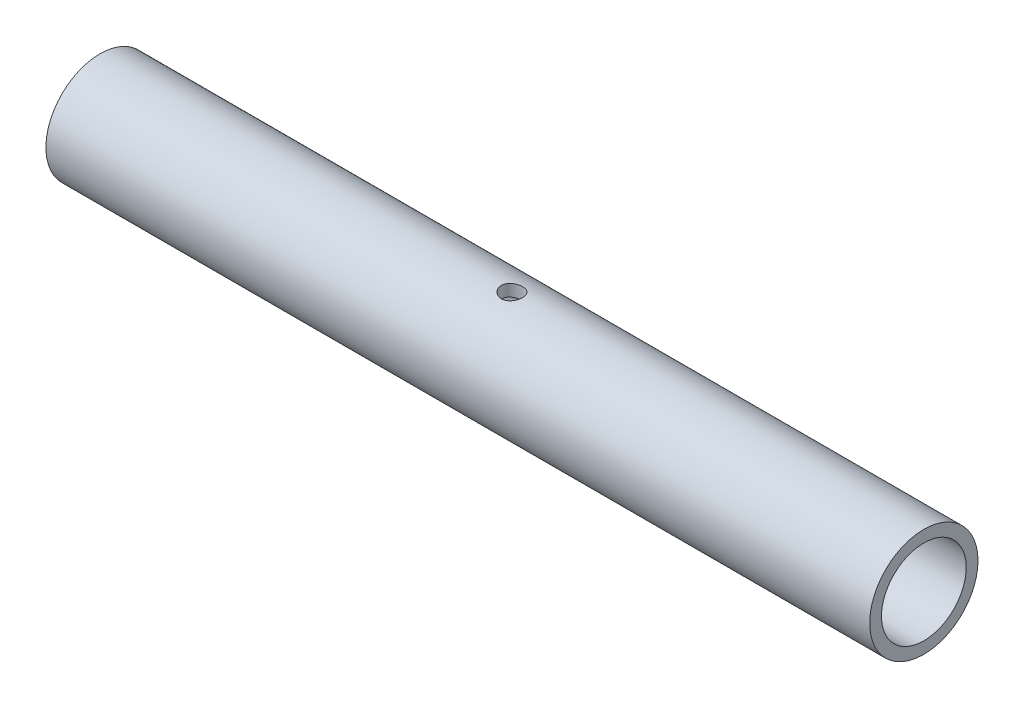
ISO-10303-21;
HEADER;
FILE_DESCRIPTION(('STEP AP214'),'2;1');
FILE_NAME('part.step','',(''),(''),'','','');
FILE_SCHEMA(('AUTOMOTIVE_DESIGN { 1 0 10303 214 1 1 1 1 }'));
ENDSEC;
DATA;
#1=APPLICATION_CONTEXT('core data for automotive mechanical design processes');
#2=APPLICATION_PROTOCOL_DEFINITION('international standard','automotive_design',2000,#1);
#3=PRODUCT_CONTEXT('',#1,'mechanical');
#4=PRODUCT('Part','Part','',(#3));
#5=PRODUCT_RELATED_PRODUCT_CATEGORY('part','',(#4));
#6=PRODUCT_DEFINITION_FORMATION('','',#4);
#7=PRODUCT_DEFINITION_CONTEXT('part definition',#1,'design');
#8=PRODUCT_DEFINITION('design','',#6,#7);
#9=PRODUCT_DEFINITION_SHAPE('','',#8);
#10=(LENGTH_UNIT() NAMED_UNIT(*) SI_UNIT(.MILLI.,.METRE.));
#11=(NAMED_UNIT(*) PLANE_ANGLE_UNIT() SI_UNIT($,.RADIAN.));
#12=(NAMED_UNIT(*) SI_UNIT($,.STERADIAN.) SOLID_ANGLE_UNIT());
#13=UNCERTAINTY_MEASURE_WITH_UNIT(LENGTH_MEASURE(1.E-05),#10,'distance_accuracy_value','');
#14=(GEOMETRIC_REPRESENTATION_CONTEXT(3) GLOBAL_UNCERTAINTY_ASSIGNED_CONTEXT((#13)) GLOBAL_UNIT_ASSIGNED_CONTEXT((#10,
#11,#12)) REPRESENTATION_CONTEXT('',''));
#15=CARTESIAN_POINT('',(0.,0.,0.));
#16=DIRECTION('',(0.,0.,1.));
#17=DIRECTION('',(1.,0.,0.));
#18=AXIS2_PLACEMENT_3D('',#15,#16,#17);
#19=CARTESIAN_POINT('',(254.,0.,0.));
#20=DIRECTION('',(1.,0.,0.));
#21=DIRECTION('',(0.,0.,-1.));
#22=AXIS2_PLACEMENT_3D('',#19,#20,#21);
#23=PLANE('',#22);
#24=CARTESIAN_POINT('',(254.,0.,0.));
#25=DIRECTION('',(1.,0.,0.));
#26=DIRECTION('',(0.,0.,-1.));
#27=AXIS2_PLACEMENT_3D('',#24,#25,#26);
#28=CIRCLE('',#27,16.7005);
#29=CARTESIAN_POINT('',(254.,0.,-16.7005));
#30=VERTEX_POINT('',#29);
#31=EDGE_CURVE('E10',#30,#30,#28,.T.);
#32=ORIENTED_EDGE('',*,*,#31,.T.);
#33=EDGE_LOOP('',(#32));
#34=FACE_BOUND('',#33,.T.);
#35=CARTESIAN_POINT('',(254.,0.,0.));
#36=DIRECTION('',(1.,0.,0.));
#37=DIRECTION('',(0.,0.,-1.));
#38=AXIS2_PLACEMENT_3D('',#35,#36,#37);
#39=CIRCLE('',#38,13.0683);
#40=CARTESIAN_POINT('',(254.,0.,-13.0683));
#41=VERTEX_POINT('',#40);
#42=EDGE_CURVE('E49',#41,#41,#39,.T.);
#43=ORIENTED_EDGE('',*,*,#42,.F.);
#44=EDGE_LOOP('',(#43));
#45=FACE_BOUND('',#44,.T.);
#46=ADVANCED_FACE('F30',(#34,#45),#23,.T.);
#47=CARTESIAN_POINT('',(0.,0.,0.));
#48=DIRECTION('',(1.,0.,0.));
#49=DIRECTION('',(0.,0.,-1.));
#50=AXIS2_PLACEMENT_3D('',#47,#48,#49);
#51=PLANE('',#50);
#52=CARTESIAN_POINT('',(0.,0.,0.));
#53=DIRECTION('',(1.,0.,0.));
#54=DIRECTION('',(0.,0.,-1.));
#55=AXIS2_PLACEMENT_3D('',#52,#53,#54);
#56=CIRCLE('',#55,16.7005);
#57=CARTESIAN_POINT('',(0.,0.,-16.7005));
#58=VERTEX_POINT('',#57);
#59=EDGE_CURVE('E44',#58,#58,#56,.T.);
#60=ORIENTED_EDGE('',*,*,#59,.F.);
#61=EDGE_LOOP('',(#60));
#62=FACE_BOUND('',#61,.T.);
#63=CARTESIAN_POINT('',(0.,0.,0.));
#64=DIRECTION('',(1.,0.,0.));
#65=DIRECTION('',(0.,0.,-1.));
#66=AXIS2_PLACEMENT_3D('',#63,#64,#65);
#67=CIRCLE('',#66,13.0683);
#68=CARTESIAN_POINT('',(0.,0.,-13.0683));
#69=VERTEX_POINT('',#68);
#70=EDGE_CURVE('E52',#69,#69,#67,.T.);
#71=ORIENTED_EDGE('',*,*,#70,.T.);
#72=EDGE_LOOP('',(#71));
#73=FACE_BOUND('',#72,.T.);
#74=ADVANCED_FACE('F88',(#62,#73),#51,.F.);
#75=CARTESIAN_POINT('',(254.,0.,0.));
#76=DIRECTION('',(-1.,0.,0.));
#77=DIRECTION('',(0.,0.,1.));
#78=AXIS2_PLACEMENT_3D('',#75,#76,#77);
#79=CYLINDRICAL_SURFACE('',#78,16.7005);
#80=CARTESIAN_POINT('',(123.7361,-16.7005,0.));
#81=CARTESIAN_POINT('',(123.736106775756,-16.7004966719391,0.181483597947742));
#82=CARTESIAN_POINT('',(123.751287775446,-16.6975113087399,0.363053771332893));
#83=CARTESIAN_POINT('',(123.811565845321,-16.6858899817864,0.721067717038991));
#84=CARTESIAN_POINT('',(123.856687233667,-16.677249424853,0.897507200417728));
#85=CARTESIAN_POINT('',(123.975403683828,-16.6552831908012,1.24003120402988));
#86=CARTESIAN_POINT('',(124.048972050381,-16.6419619072453,1.40612526346626));
#87=CARTESIAN_POINT('',(124.222416098506,-16.6120847923371,1.72359982001725));
#88=CARTESIAN_POINT('',(124.322290005034,-16.5955291792501,1.8749813089626));
#89=CARTESIAN_POINT('',(124.54688305753,-16.5607675429942,2.1607084870949));
#90=CARTESIAN_POINT('',(124.671877204119,-16.5425445895903,2.29483597685554));
#91=CARTESIAN_POINT('',(124.942571297181,-16.5066262038143,2.54035904431321));
#92=CARTESIAN_POINT('',(125.088272810045,-16.4889308114717,2.65175290078985));
#93=CARTESIAN_POINT('',(125.397805025885,-16.4559060542504,2.84956751041692));
#94=CARTESIAN_POINT('',(125.56178170667,-16.440598490149,2.93576380448387));
#95=CARTESIAN_POINT('',(125.902238566393,-16.4143223190422,3.07929892720361));
#96=CARTESIAN_POINT('',(126.078717567108,-16.4033533038102,3.13664047102126));
#97=CARTESIAN_POINT('',(126.43682660245,-16.3871671511717,3.22013301241122));
#98=CARTESIAN_POINT('',(126.61836433271,-16.3818796336776,3.24666599436722));
#99=CARTESIAN_POINT('',(126.983385832867,-16.3774431798516,3.26897441242651));
#100=CARTESIAN_POINT('',(127.166869411181,-16.3782936446905,3.26475284898047));
#101=CARTESIAN_POINT('',(127.527789679386,-16.3859730690505,3.22598118443871));
#102=CARTESIAN_POINT('',(127.705275371228,-16.3927159656055,3.19186765635166));
#103=CARTESIAN_POINT('',(128.051954938799,-16.4112851101643,3.09496894705632));
#104=CARTESIAN_POINT('',(128.221148434318,-16.4231115910164,3.03218245250376));
#105=CARTESIAN_POINT('',(128.547706130163,-16.4506040829533,2.87929947973738));
#106=CARTESIAN_POINT('',(128.704986618325,-16.4662944654566,2.78902875651037));
#107=CARTESIAN_POINT('',(129.002331662869,-16.4997310306065,2.58386283029639));
#108=CARTESIAN_POINT('',(129.142394323867,-16.5174774391689,2.46896492009798));
#109=CARTESIAN_POINT('',(129.40384820398,-16.5534001313523,2.21546259747301));
#110=CARTESIAN_POINT('',(129.52487784656,-16.5715785664494,2.07648527306975));
#111=CARTESIAN_POINT('',(129.741962257696,-16.6060378767627,1.78001160313921));
#112=CARTESIAN_POINT('',(129.838016733025,-16.6223187296989,1.6225150402147));
#113=CARTESIAN_POINT('',(130.002485980909,-16.6511857448123,1.29308111551052));
#114=CARTESIAN_POINT('',(130.070860808202,-16.6637665602585,1.12112331316856));
#115=CARTESIAN_POINT('',(130.177651774277,-16.6837751432131,0.767861427035756));
#116=CARTESIAN_POINT('',(130.216071375564,-16.691203506279,0.586558426034048));
#117=CARTESIAN_POINT('',(130.261352603597,-16.6999876907162,0.222861171440751));
#118=CARTESIAN_POINT('',(130.2687092719,-16.7014387613551,0.0405307799548781));
#119=CARTESIAN_POINT('',(130.252987038392,-16.6983688866494,-0.322754231602682));
#120=CARTESIAN_POINT('',(130.229909766959,-16.6938482612146,-0.503708924849627));
#121=CARTESIAN_POINT('',(130.154386130064,-16.679402432097,-0.857518845901425));
#122=CARTESIAN_POINT('',(130.102192463689,-16.6695237507744,-1.0304300801412));
#123=CARTESIAN_POINT('',(129.970192763857,-16.6454652259661,-1.36504700995945));
#124=CARTESIAN_POINT('',(129.890384732214,-16.6312850712336,-1.52675189362589));
#125=CARTESIAN_POINT('',(129.704341624287,-16.5999591227001,-1.83646298433188));
#126=CARTESIAN_POINT('',(129.597806850211,-16.5827804191035,-1.98428576503835));
#127=CARTESIAN_POINT('',(129.361737252328,-16.5474430314081,-2.26013352813523));
#128=CARTESIAN_POINT('',(129.232200081546,-16.5292842474417,-2.38815648781824));
#129=CARTESIAN_POINT('',(128.951553730027,-16.4937141213386,-2.62267015659225));
#130=CARTESIAN_POINT('',(128.800159005092,-16.4763174339377,-2.72882175212988));
#131=CARTESIAN_POINT('',(128.481396569498,-16.4445457864632,-2.91418860150566));
#132=CARTESIAN_POINT('',(128.314029482456,-16.4301707084856,-2.99340490644003));
#133=CARTESIAN_POINT('',(127.968898428124,-16.406186989638,-3.12218287646266));
#134=CARTESIAN_POINT('',(127.791192165306,-16.3965542890212,-3.17189449915426));
#135=CARTESIAN_POINT('',(127.429741750409,-16.3830934803205,-3.24070974683919));
#136=CARTESIAN_POINT('',(127.245998348699,-16.3792646536275,-3.25981716112136));
#137=CARTESIAN_POINT('',(126.881091191514,-16.3778837287058,-3.26674633387894));
#138=CARTESIAN_POINT('',(126.69993779729,-16.3802241945844,-3.25510358772846));
#139=CARTESIAN_POINT('',(126.342224427647,-16.3906787750187,-3.20204126403765));
#140=CARTESIAN_POINT('',(126.165664418971,-16.3987928477609,-3.16062190214508));
#141=CARTESIAN_POINT('',(125.822470853863,-16.419833385607,-3.04941620512077));
#142=CARTESIAN_POINT('',(125.655816247381,-16.4327491889843,-2.97969268503245));
#143=CARTESIAN_POINT('',(125.336486037849,-16.4619445128348,-2.81391821816692));
#144=CARTESIAN_POINT('',(125.183811540286,-16.4782242989868,-2.71786519175718));
#145=CARTESIAN_POINT('',(124.894102989115,-16.5126437731481,-2.50031714525346));
#146=CARTESIAN_POINT('',(124.757363204566,-16.5308093725168,-2.37843427754532));
#147=CARTESIAN_POINT('',(124.506099262145,-16.5667647976037,-2.11349014710452));
#148=CARTESIAN_POINT('',(124.391580214566,-16.5845545360457,-1.97042402598339));
#149=CARTESIAN_POINT('',(124.186940635134,-16.6179613743855,-1.66547201824119));
#150=CARTESIAN_POINT('',(124.09707321668,-16.6335551890088,-1.50341363159979));
#151=CARTESIAN_POINT('',(123.945987585852,-16.6605847291089,-1.16623959090203));
#152=CARTESIAN_POINT('',(123.884743144469,-16.6720242592617,-0.991136062224215));
#153=CARTESIAN_POINT('',(123.804717605944,-16.6871929046613,-0.679660912139079));
#154=CARTESIAN_POINT('',(123.779031167417,-16.6921542444122,-0.545080722884243));
#155=CARTESIAN_POINT('',(123.744720059972,-16.6988089990342,-0.27368339169512));
#156=CARTESIAN_POINT('',(123.736094890047,-16.7005025098655,-0.136866315566457));
#157=CARTESIAN_POINT('',(123.7361,-16.7005,0.));
#158=B_SPLINE_CURVE_WITH_KNOTS('',3,(#80,#81,#82,#83,#84,#85,#86,#87,#88,#89,#90,#91,#92,#93,
#94,#95,#96,#97,#98,#99,#100,#101,#102,#103,#104,#105,#106,#107,#108,#109,#110,#111,#112,#113,
#114,#115,#116,#117,#118,#119,#120,#121,#122,#123,#124,#125,#126,#127,#128,#129,#130,#131,#132,
#133,#134,#135,#136,#137,#138,#139,#140,#141,#142,#143,#144,#145,#146,#147,#148,#149,#150,#151,
#152,#153,#154,#155,#156,#157),.UNSPECIFIED.,.T.,.F.,(4,2,2,2,2,2,2,2,2,2,2,2,2,2,2,2,2,2,2,2,2,
2,2,2,2,2,2,2,2,2,2,2,2,2,2,2,2,2,4),(0.,0.543950159324411,1.08834266710056,1.63222554010916,
2.17607172242006,2.72623219078756,3.27643429774323,3.83139784085203,4.38630915341318,
4.93426426573039,5.48216591959973,6.02219638264132,6.5622515838647,7.10580456443049,
7.64941732722914,8.20235688641288,8.75530293719887,9.30904413910584,9.86272132492762,
10.4075405998757,10.9523306894876,11.4924645384159,12.0326374797938,12.5791618209733,
13.1257419570842,13.6802470524964,14.2347305069643,14.7863711140939,15.3379434140415,
15.8799740141397,16.4220006887916,16.9628309703467,17.5037039816243,18.0533608295184,
18.6031439372836,19.1583769915035,19.7131002487933,20.1233336874724,20.53355507938),.UNSPECIFIED.);
#159=CARTESIAN_POINT('',(123.7361,-16.7005,0.));
#160=VERTEX_POINT('',#159);
#161=EDGE_CURVE('E77',#160,#160,#158,.T.);
#162=ORIENTED_EDGE('',*,*,#161,.T.);
#163=EDGE_LOOP('',(#162));
#164=FACE_BOUND('',#163,.T.);
#165=CARTESIAN_POINT('',(127.,16.3784509963549,3.26389999999997));
#166=CARTESIAN_POINT('',(126.818553713714,16.3784545734147,3.26389319517557));
#167=CARTESIAN_POINT('',(126.637020772944,16.3814989535375,3.24871822583977));
#168=CARTESIAN_POINT('',(126.279084138745,16.393330666063,3.18846627888111));
#169=CARTESIAN_POINT('',(126.102684764659,16.4021226964371,3.1433648397313));
#170=CARTESIAN_POINT('',(125.760245700198,16.4244167855804,3.02470671339751));
#171=CARTESIAN_POINT('',(125.594196130777,16.4379142691773,2.95117765920535));
#172=CARTESIAN_POINT('',(125.27679656067,16.4680930077172,2.77782627707842));
#173=CARTESIAN_POINT('',(125.125445619345,16.4847740587251,2.6780056331935));
#174=CARTESIAN_POINT('',(124.839685782665,16.5196921397592,2.45346715399136));
#175=CARTESIAN_POINT('',(124.705504337154,16.5379455711721,2.32846235907666));
#176=CARTESIAN_POINT('',(124.459876610062,16.5738071694482,2.05772407732135));
#177=CARTESIAN_POINT('',(124.348431883978,16.591415292096,1.91198917342002));
#178=CARTESIAN_POINT('',(124.150562586048,16.6241787687936,1.60242588580065));
#179=CARTESIAN_POINT('',(124.064353531285,16.6393125342302,1.43845726533343));
#180=CARTESIAN_POINT('',(123.920792617122,16.6652381312399,1.09801784501548));
#181=CARTESIAN_POINT('',(123.86343817922,16.6760303507642,0.921548163890675));
#182=CARTESIAN_POINT('',(123.779920880201,16.6919410030019,0.563475145343534));
#183=CARTESIAN_POINT('',(123.753374176773,16.6971292000769,0.381964487071239));
#184=CARTESIAN_POINT('',(123.731028925503,16.7014880032639,0.0169965480074079));
#185=CARTESIAN_POINT('',(123.735227542913,16.7006591641522,-0.166460551763006));
#186=CARTESIAN_POINT('',(123.773961410014,16.6931315126249,-0.527478063177689));
#187=CARTESIAN_POINT('',(123.808083259146,16.6865126940083,-0.705084738918122));
#188=CARTESIAN_POINT('',(123.905039985385,16.6682388041442,-1.05200191286461));
#189=CARTESIAN_POINT('',(123.967875974111,16.6565835379202,-1.22131208960472));
#190=CARTESIAN_POINT('',(124.120864327927,16.6294138104733,-1.54801686284208));
#191=CARTESIAN_POINT('',(124.211179877845,16.6138763968313,-1.7053330568331));
#192=CARTESIAN_POINT('',(124.416443068428,16.5806572402267,-2.00273080915886));
#193=CARTESIAN_POINT('',(124.531393421363,16.5629752612425,-2.14281046709115));
#194=CARTESIAN_POINT('',(124.784934887528,16.5270746871382,-2.40421067249115));
#195=CARTESIAN_POINT('',(124.923887754359,16.5088520592065,-2.52518004544845));
#196=CARTESIAN_POINT('',(125.220290366222,16.4742040536849,-2.74215423995587));
#197=CARTESIAN_POINT('',(125.377740430266,16.4577787071014,-2.83815863085572));
#198=CARTESIAN_POINT('',(125.70715791349,16.4285778238497,-3.00259091721656));
#199=CARTESIAN_POINT('',(125.87915331242,16.4158095388093,-3.07096413127713));
#200=CARTESIAN_POINT('',(126.232497463898,16.3954764923766,-3.17774053863906));
#201=CARTESIAN_POINT('',(126.413845054132,16.3879110860246,-3.21614744670498));
#202=CARTESIAN_POINT('',(126.777568960479,16.3789689965078,-3.26138067693054));
#203=CARTESIAN_POINT('',(126.959879959505,16.377493133792,-3.26871315798878));
#204=CARTESIAN_POINT('',(127.323120534865,16.3806313171536,-3.25294947975415));
#205=CARTESIAN_POINT('',(127.504050185252,16.3852450344327,-3.22985496332418));
#206=CARTESIAN_POINT('',(127.857704709797,16.3999498332161,-3.15432854360267));
#207=CARTESIAN_POINT('',(128.03048920925,16.409990751327,-3.10216518758293));
#208=CARTESIAN_POINT('',(128.364865954816,16.4343748926875,-2.97026813679652));
#209=CARTESIAN_POINT('',(128.526457313451,16.4487184566051,-2.89053225886072));
#210=CARTESIAN_POINT('',(128.836081213854,16.4803156776608,-2.70460067314256));
#211=CARTESIAN_POINT('',(128.983919341983,16.4976034233431,-2.59808712150518));
#212=CARTESIAN_POINT('',(129.259807826755,16.5330467132823,-2.36204922324446));
#213=CARTESIAN_POINT('',(129.387856240651,16.5512023425103,-2.23252262011955));
#214=CARTESIAN_POINT('',(129.622439097894,16.5866564256626,-1.95186745841594));
#215=CARTESIAN_POINT('',(129.728631982575,16.6039384859889,-1.80045100835698));
#216=CARTESIAN_POINT('',(129.914071192321,16.6354166114285,-1.48163273835385));
#217=CARTESIAN_POINT('',(129.993318615317,16.6496128022712,-1.31423157008527));
#218=CARTESIAN_POINT('',(130.122114494975,16.6732494760108,-0.969110676321435));
#219=CARTESIAN_POINT('',(130.171826225197,16.6827160570596,-0.791453749445667));
#220=CARTESIAN_POINT('',(130.240658350753,16.6959385983282,-0.430108531071001));
#221=CARTESIAN_POINT('',(130.25978225666,16.6996952138801,-0.246420934183898));
#222=CARTESIAN_POINT('',(130.266765017419,16.701059976732,0.118504114218192));
#223=CARTESIAN_POINT('',(130.255138258006,16.6987692823771,0.299731543011307));
#224=CARTESIAN_POINT('',(130.202082074801,16.6885085729308,0.657597247741723));
#225=CARTESIAN_POINT('',(130.160652991613,16.6805386227465,0.834235576103096));
#226=CARTESIAN_POINT('',(130.04939244875,16.6598166907006,1.17760651202132));
#227=CARTESIAN_POINT('',(129.979620182091,16.6470746793019,1.34435893899573));
#228=CARTESIAN_POINT('',(129.81371758837,16.6181833340721,1.66386484230208));
#229=CARTESIAN_POINT('',(129.717585294415,16.6020337460002,1.81661727286795));
#230=CARTESIAN_POINT('',(129.499943134021,16.567790330572,2.10633794767418));
#231=CARTESIAN_POINT('',(129.378063903588,16.5496703049923,2.2430256556268));
#232=CARTESIAN_POINT('',(129.113149352625,16.5136874296903,2.49418621724253));
#233=CARTESIAN_POINT('',(128.97010904311,16.4958246417077,2.60865381748637));
#234=CARTESIAN_POINT('',(128.665184399487,16.4621787073227,2.81322943497199));
#235=CARTESIAN_POINT('',(128.503122773793,16.4464186262533,2.90307713484601));
#236=CARTESIAN_POINT('',(128.165943578095,16.4190426235692,3.05412503906776));
#237=CARTESIAN_POINT('',(127.990838204351,16.4074228879929,3.11535162462943));
#238=CARTESIAN_POINT('',(127.679408964778,16.3920013024287,3.19533359258452));
#239=CARTESIAN_POINT('',(127.544879355037,16.3869509369549,3.22100071612694));
#240=CARTESIAN_POINT('',(127.2735828724,16.3801744879065,3.25528621562195));
#241=CARTESIAN_POINT('',(127.136816070436,16.3784482991421,3.26390513104648));
#242=CARTESIAN_POINT('',(127.,16.3784509963549,3.26389999999997));
#243=B_SPLINE_CURVE_WITH_KNOTS('',3,(#165,#166,#167,#168,#169,#170,#171,#172,#173,#174,#175,
#176,#177,#178,#179,#180,#181,#182,#183,#184,#185,#186,#187,#188,#189,#190,#191,#192,#193,#194,
#195,#196,#197,#198,#199,#200,#201,#202,#203,#204,#205,#206,#207,#208,#209,#210,#211,#212,#213,
#214,#215,#216,#217,#218,#219,#220,#221,#222,#223,#224,#225,#226,#227,#228,#229,#230,#231,#232,
#233,#234,#235,#236,#237,#238,#239,#240,#241,#242),.UNSPECIFIED.,.T.,.F.,(4,2,2,2,2,2,2,2,2,2,2,
2,2,2,2,2,2,2,2,2,2,2,2,2,2,2,2,2,2,2,2,2,2,2,2,2,2,2,4),(0.,0.543838011851132,1.08812109867869,
1.63187644133418,2.17559696340594,2.72590420295353,3.2762490782831,3.831165346531,
4.38603201763736,4.93390859919531,5.48173466666149,6.02210947590471,6.56250520661795,
7.10617482279139,7.64990432727748,8.20268697648642,8.7554791606594,9.30936001165929,
9.86317219006378,10.4079280171506,10.9526544321187,11.4924299764933,12.032248269632,
12.5788044673675,13.125414286251,13.6800080693687,14.2345792520847,14.7860555271326,
15.3374685045301,15.8797162227245,16.4219577437688,16.9630726011032,17.504227845529,
18.0537494335348,18.6034007851143,19.1586573535361,19.713401105892,20.1234846400338,
20.5335551973219),.UNSPECIFIED.);
#244=CARTESIAN_POINT('',(127.,16.3784509963549,3.26389999999997));
#245=VERTEX_POINT('',#244);
#246=EDGE_CURVE('E72',#245,#245,#243,.T.);
#247=ORIENTED_EDGE('',*,*,#246,.T.);
#248=EDGE_LOOP('',(#247));
#249=FACE_BOUND('',#248,.T.);
#250=ORIENTED_EDGE('',*,*,#31,.F.);
#251=EDGE_LOOP('',(#250));
#252=FACE_BOUND('',#251,.T.);
#253=ORIENTED_EDGE('',*,*,#59,.T.);
#254=EDGE_LOOP('',(#253));
#255=FACE_BOUND('',#254,.T.);
#256=ADVANCED_FACE('F32',(#164,#249,#252,#255),#79,.T.);
#257=CARTESIAN_POINT('',(254.,0.,0.));
#258=DIRECTION('',(-1.,0.,0.));
#259=DIRECTION('',(0.,0.,1.));
#260=AXIS2_PLACEMENT_3D('',#257,#258,#259);
#261=CYLINDRICAL_SURFACE('',#260,13.0683);
#262=CARTESIAN_POINT('',(127.,-12.6541464224182,3.26389999999997));
#263=CARTESIAN_POINT('',(127.1802396199,-12.6541498665457,3.26389487005727));
#264=CARTESIAN_POINT('',(127.360536048144,-12.658039343354,3.24891931447462));
#265=CARTESIAN_POINT('',(127.715951791757,-12.6731373508395,3.18950804081929));
#266=CARTESIAN_POINT('',(127.891068025902,-12.6843501494954,3.14505514333585));
#267=CARTESIAN_POINT('',(128.230931048979,-12.7127474566362,3.02821731292329));
#268=CARTESIAN_POINT('',(128.39569089023,-12.7299242628337,2.95586839338792));
#269=CARTESIAN_POINT('',(128.710752207812,-12.7683046059048,2.78540185976016));
#270=CARTESIAN_POINT('',(128.861053077271,-12.7895083116844,2.68728316470388));
#271=CARTESIAN_POINT('',(129.146231122008,-12.8340746644002,2.46576046210241));
#272=CARTESIAN_POINT('',(129.280743914941,-12.8574717499442,2.34189420249946));
#273=CARTESIAN_POINT('',(129.527317505339,-12.9034898264856,2.07338814629195));
#274=CARTESIAN_POINT('',(129.639376206887,-12.9261107448704,1.92874641261629));
#275=CARTESIAN_POINT('',(129.839351086013,-12.9684086913342,1.62029941508486));
#276=CARTESIAN_POINT('',(129.926909364519,-12.9880403413031,1.45625535390379));
#277=CARTESIAN_POINT('',(130.073070936331,-13.021754935617,1.11520517144153));
#278=CARTESIAN_POINT('',(130.131678493193,-13.0358386969344,0.938200963205098));
#279=CARTESIAN_POINT('',(130.21710801356,-13.0566271990577,0.580053588307863));
#280=CARTESIAN_POINT('',(130.244548738134,-13.063475389697,0.399066486178456));
#281=CARTESIAN_POINT('',(130.268807846041,-13.0695210078802,0.0349367976721254));
#282=CARTESIAN_POINT('',(130.265630748347,-13.0687195644559,-0.148205466633074));
#283=CARTESIAN_POINT('',(130.229189551416,-13.059663021681,-0.507155486008179));
#284=CARTESIAN_POINT('',(130.196593339444,-13.0515733895928,-0.683035849279494));
#285=CARTESIAN_POINT('',(130.103312673688,-13.0290420651723,-1.02674690486388));
#286=CARTESIAN_POINT('',(130.042626726324,-13.0146000350744,-1.19457716861578));
#287=CARTESIAN_POINT('',(129.894348437679,-12.980733407514,-1.51918431677917));
#288=CARTESIAN_POINT('',(129.806518281248,-12.9612650318926,-1.67584781392578));
#289=CARTESIAN_POINT('',(129.606625134981,-12.9194576855627,-1.97244647237706));
#290=CARTESIAN_POINT('',(129.494557936502,-12.8971182165768,-2.11237872182197));
#291=CARTESIAN_POINT('',(129.245791115002,-12.8512911900573,-2.37552576964437));
#292=CARTESIAN_POINT('',(129.108507868444,-12.8277889203778,-2.49818686603544));
#293=CARTESIAN_POINT('',(128.815074128702,-12.7828374370845,-2.71886950242737));
#294=CARTESIAN_POINT('',(128.658922757694,-12.7613883190751,-2.81688989538567));
#295=CARTESIAN_POINT('',(128.331100722953,-12.7229191456513,-2.98586230738371));
#296=CARTESIAN_POINT('',(128.159358723904,-12.7059209896026,-3.0566812595333));
#297=CARTESIAN_POINT('',(127.805879585738,-12.6785594740963,-3.16826944176));
#298=CARTESIAN_POINT('',(127.624144589713,-12.6681946980278,-3.20904508810496));
#299=CARTESIAN_POINT('',(127.2609725574,-12.6555707305042,-3.25847099196052));
#300=CARTESIAN_POINT('',(127.079653971926,-12.6531050561873,-3.26793982748042));
#301=CARTESIAN_POINT('',(126.718027139436,-12.6559964618753,-3.25672414151975));
#302=CARTESIAN_POINT('',(126.537718801144,-12.6613528233241,-3.23604238976434));
#303=CARTESIAN_POINT('',(126.186268867378,-12.6790869347488,-3.16583028143518));
#304=CARTESIAN_POINT('',(126.015025686759,-12.6913486522407,-3.11677631143261));
#305=CARTESIAN_POINT('',(125.683192962961,-12.7214017722217,-2.99174032174483));
#306=CARTESIAN_POINT('',(125.522604682582,-12.7391938287409,-2.91575511696363));
#307=CARTESIAN_POINT('',(125.21317131858,-12.7787378056656,-2.73729950737114));
#308=CARTESIAN_POINT('',(125.064617791119,-12.800560449758,-2.63433957686156));
#309=CARTESIAN_POINT('',(124.786595818126,-12.8455331169144,-2.40547632524734));
#310=CARTESIAN_POINT('',(124.65713050892,-12.8686833572457,-2.27956924135001));
#311=CARTESIAN_POINT('',(124.417645201122,-12.9144023998633,-2.00462943791343));
#312=CARTESIAN_POINT('',(124.308191401428,-12.9369422542905,-1.8550978213816));
#313=CARTESIAN_POINT('',(124.115947791584,-12.978302496039,-1.53930184599166));
#314=CARTESIAN_POINT('',(124.033156591338,-12.9971230772504,-1.37303836006807));
#315=CARTESIAN_POINT('',(123.897306403895,-13.0288056526969,-1.0296466643507));
#316=CARTESIAN_POINT('',(123.844033739164,-13.0417103497647,-0.852607114159676));
#317=CARTESIAN_POINT('',(123.768091192076,-13.0602940680189,-0.49172355632433));
#318=CARTESIAN_POINT('',(123.745415415958,-13.0659744807796,-0.307880866154806));
#319=CARTESIAN_POINT('',(123.731641315957,-13.0694129307713,0.0560707028070052));
#320=CARTESIAN_POINT('',(123.73970732666,-13.0673806319752,0.236146453787138));
#321=CARTESIAN_POINT('',(123.785274133431,-13.0560868218867,0.592290476790369));
#322=CARTESIAN_POINT('',(123.82277405721,-13.0468255248294,0.768358867414615));
#323=CARTESIAN_POINT('',(123.925696394425,-13.0221466091123,1.1106174435097));
#324=CARTESIAN_POINT('',(123.990967969721,-13.006762275664,1.27685554493358));
#325=CARTESIAN_POINT('',(124.147443858135,-12.9714574984479,1.59611451109599));
#326=CARTESIAN_POINT('',(124.238651434714,-12.951536483904,1.74913370937272));
#327=CARTESIAN_POINT('',(124.446960335674,-12.9087110855812,2.04157448090382));
#328=CARTESIAN_POINT('',(124.564628805973,-12.8857467421418,2.1805832918166));
#329=CARTESIAN_POINT('',(124.82141784786,-12.8396930445191,2.43716587446906));
#330=CARTESIAN_POINT('',(124.960543847506,-12.8166036601345,2.55473420599458));
#331=CARTESIAN_POINT('',(125.25941529672,-12.7724250306431,2.7672461933805));
#332=CARTESIAN_POINT('',(125.419496291267,-12.7513810048743,2.86172808491328));
#333=CARTESIAN_POINT('',(125.75377250076,-12.7142840346146,3.02229805206948));
#334=CARTESIAN_POINT('',(125.927957322058,-12.6982274561339,3.08840681459617));
#335=CARTESIAN_POINT('',(126.251533075695,-12.6754365623556,3.18049600309898));
#336=CARTESIAN_POINT('',(126.399373919597,-12.6675127842803,3.21170439030432));
#337=CARTESIAN_POINT('',(126.698130067843,-12.656866492936,3.25340765729332));
#338=CARTESIAN_POINT('',(126.849045109947,-12.654143537881,3.26390429644675));
#339=CARTESIAN_POINT('',(127.,-12.6541464224182,3.26389999999997));
#340=B_SPLINE_CURVE_WITH_KNOTS('',3,(#262,#263,#264,#265,#266,#267,#268,#269,#270,#271,#272,
#273,#274,#275,#276,#277,#278,#279,#280,#281,#282,#283,#284,#285,#286,#287,#288,#289,#290,#291,
#292,#293,#294,#295,#296,#297,#298,#299,#300,#301,#302,#303,#304,#305,#306,#307,#308,#309,#310,
#311,#312,#313,#314,#315,#316,#317,#318,#319,#320,#321,#322,#323,#324,#325,#326,#327,#328,#329,
#330,#331,#332,#333,#334,#335,#336,#337,#338,#339),.UNSPECIFIED.,.T.,.F.,(4,2,2,2,2,2,2,2,2,2,2,
2,2,2,2,2,2,2,2,2,2,2,2,2,2,2,2,2,2,2,2,2,2,2,2,2,2,2,4),(0.,0.540164514716896,1.08064411461008,
1.62042828619218,2.16023510369987,2.71073184489949,3.26127994687038,3.81949414064445,
4.37762610200201,4.92447229397421,5.47123777657098,6.00589418676205,6.54057902880637,
7.08008790696719,7.61969054350123,8.17386956862667,8.72807438641131,9.28495680348959,
9.84172025419008,10.3838058285248,10.9258416083583,11.4590300990647,11.9922816698166,
12.5359760396294,13.0797596428567,13.6371200064458,14.1944513065093,14.7476936804915,
15.3008294702842,15.8390377947818,16.3772301697911,16.9125360050735,17.4479092263455,
17.9960874158373,18.5444045047421,19.1029258036373,19.6610391889229,20.1134780165111,
20.5658784098025),.UNSPECIFIED.);
#341=CARTESIAN_POINT('',(127.,-12.6541464224182,3.26389999999997));
#342=VERTEX_POINT('',#341);
#343=EDGE_CURVE('E35',#342,#342,#340,.T.);
#344=ORIENTED_EDGE('',*,*,#343,.F.);
#345=EDGE_LOOP('',(#344));
#346=FACE_BOUND('',#345,.T.);
#347=CARTESIAN_POINT('',(127.,12.6541464224182,3.26389999999997));
#348=CARTESIAN_POINT('',(126.8197603801,12.6541498665457,3.26389487005727));
#349=CARTESIAN_POINT('',(126.639463951856,12.658039343354,3.24891931447462));
#350=CARTESIAN_POINT('',(126.284048208243,12.6731373508395,3.18950804081929));
#351=CARTESIAN_POINT('',(126.108931974098,12.6843501494954,3.14505514333585));
#352=CARTESIAN_POINT('',(125.769068951021,12.7127474566362,3.02821731292329));
#353=CARTESIAN_POINT('',(125.60430910977,12.7299242628337,2.95586839338792));
#354=CARTESIAN_POINT('',(125.289247792188,12.7683046059048,2.78540185976016));
#355=CARTESIAN_POINT('',(125.138946922729,12.7895083116843,2.68728316470388));
#356=CARTESIAN_POINT('',(124.853768877992,12.8340746644002,2.46576046210242));
#357=CARTESIAN_POINT('',(124.71925608506,12.8574717499442,2.34189420249946));
#358=CARTESIAN_POINT('',(124.472682494661,12.9034898264856,2.07338814629195));
#359=CARTESIAN_POINT('',(124.360623793113,12.9261107448704,1.92874641261629));
#360=CARTESIAN_POINT('',(124.160648913987,12.9684086913342,1.62029941508486));
#361=CARTESIAN_POINT('',(124.073090635481,12.9880403413031,1.4562553539038));
#362=CARTESIAN_POINT('',(123.926929063669,13.021754935617,1.11520517144153));
#363=CARTESIAN_POINT('',(123.868321506807,13.0358386969344,0.938200963205097));
#364=CARTESIAN_POINT('',(123.78289198644,13.0566271990577,0.580053588307859));
#365=CARTESIAN_POINT('',(123.755451261866,13.063475389697,0.399066486178454));
#366=CARTESIAN_POINT('',(123.731192153959,13.0695210078802,0.0349367976721225));
#367=CARTESIAN_POINT('',(123.734369251653,13.0687195644559,-0.148205466633079));
#368=CARTESIAN_POINT('',(123.770810448584,13.059663021681,-0.507155486008183));
#369=CARTESIAN_POINT('',(123.803406660556,13.0515733895928,-0.683035849279494));
#370=CARTESIAN_POINT('',(123.896687326312,13.0290420651723,-1.02674690486388));
#371=CARTESIAN_POINT('',(123.957373273676,13.0146000350744,-1.19457716861578));
#372=CARTESIAN_POINT('',(124.105651562321,12.980733407514,-1.51918431677917));
#373=CARTESIAN_POINT('',(124.193481718752,12.9612650318926,-1.67584781392577));
#374=CARTESIAN_POINT('',(124.393374865019,12.9194576855627,-1.97244647237706));
#375=CARTESIAN_POINT('',(124.505442063498,12.8971182165768,-2.11237872182197));
#376=CARTESIAN_POINT('',(124.754208884998,12.8512911900573,-2.37552576964437));
#377=CARTESIAN_POINT('',(124.891492131556,12.8277889203778,-2.49818686603543));
#378=CARTESIAN_POINT('',(125.184925871298,12.7828374370845,-2.71886950242736));
#379=CARTESIAN_POINT('',(125.341077242306,12.7613883190751,-2.81688989538567));
#380=CARTESIAN_POINT('',(125.668899277047,12.7229191456513,-2.98586230738371));
#381=CARTESIAN_POINT('',(125.840641276096,12.7059209896026,-3.0566812595333));
#382=CARTESIAN_POINT('',(126.194120414262,12.6785594740963,-3.16826944176));
#383=CARTESIAN_POINT('',(126.375855410288,12.6681946980278,-3.20904508810496));
#384=CARTESIAN_POINT('',(126.7390274426,12.6555707305042,-3.25847099196052));
#385=CARTESIAN_POINT('',(126.920346028074,12.6531050561873,-3.26793982748043));
#386=CARTESIAN_POINT('',(127.281972860564,12.6559964618753,-3.25672414151975));
#387=CARTESIAN_POINT('',(127.462281198856,12.6613528233241,-3.23604238976434));
#388=CARTESIAN_POINT('',(127.813731132622,12.6790869347488,-3.16583028143518));
#389=CARTESIAN_POINT('',(127.984974313241,12.6913486522407,-3.11677631143261));
#390=CARTESIAN_POINT('',(128.316807037039,12.7214017722217,-2.99174032174483));
#391=CARTESIAN_POINT('',(128.477395317418,12.7391938287409,-2.91575511696363));
#392=CARTESIAN_POINT('',(128.78682868142,12.7787378056656,-2.73729950737114));
#393=CARTESIAN_POINT('',(128.935382208881,12.800560449758,-2.63433957686156));
#394=CARTESIAN_POINT('',(129.213404181874,12.8455331169144,-2.40547632524734));
#395=CARTESIAN_POINT('',(129.34286949108,12.8686833572457,-2.27956924135));
#396=CARTESIAN_POINT('',(129.582354798878,12.9144023998633,-2.00462943791343));
#397=CARTESIAN_POINT('',(129.691808598572,12.9369422542905,-1.85509782138161));
#398=CARTESIAN_POINT('',(129.884052208416,12.978302496039,-1.53930184599166));
#399=CARTESIAN_POINT('',(129.966843408662,12.9971230772504,-1.37303836006806));
#400=CARTESIAN_POINT('',(130.102693596105,13.0288056526969,-1.02964666435068));
#401=CARTESIAN_POINT('',(130.155966260836,13.0417103497647,-0.85260711415966));
#402=CARTESIAN_POINT('',(130.231908807924,13.0602940680189,-0.491723556324322));
#403=CARTESIAN_POINT('',(130.254584584042,13.0659744807796,-0.307880866154799));
#404=CARTESIAN_POINT('',(130.268358684043,13.0694129307713,0.0560707028070125));
#405=CARTESIAN_POINT('',(130.26029267334,13.0673806319752,0.236146453787146));
#406=CARTESIAN_POINT('',(130.214725866569,13.0560868218867,0.592290476790374));
#407=CARTESIAN_POINT('',(130.17722594279,13.0468255248294,0.768358867414616));
#408=CARTESIAN_POINT('',(130.074303605575,13.0221466091123,1.1106174435097));
#409=CARTESIAN_POINT('',(130.009032030279,13.006762275664,1.27685554493358));
#410=CARTESIAN_POINT('',(129.852556141865,12.9714574984479,1.596114511096));
#411=CARTESIAN_POINT('',(129.761348565286,12.951536483904,1.74913370937273));
#412=CARTESIAN_POINT('',(129.553039664326,12.9087110855812,2.04157448090383));
#413=CARTESIAN_POINT('',(129.435371194027,12.8857467421418,2.18058329181663));
#414=CARTESIAN_POINT('',(129.17858215214,12.8396930445191,2.43716587446908));
#415=CARTESIAN_POINT('',(129.039456152494,12.8166036601345,2.55473420599459));
#416=CARTESIAN_POINT('',(128.74058470328,12.7724250306431,2.76724619338051));
#417=CARTESIAN_POINT('',(128.580503708733,12.7513810048743,2.86172808491328));
#418=CARTESIAN_POINT('',(128.24622749924,12.7142840346146,3.02229805206948));
#419=CARTESIAN_POINT('',(128.072042677942,12.6982274561339,3.08840681459617));
#420=CARTESIAN_POINT('',(127.748466924305,12.6754365623556,3.18049600309898));
#421=CARTESIAN_POINT('',(127.600626080403,12.6675127842803,3.21170439030432));
#422=CARTESIAN_POINT('',(127.301869932157,12.656866492936,3.25340765729332));
#423=CARTESIAN_POINT('',(127.150954890053,12.654143537881,3.26390429644675));
#424=CARTESIAN_POINT('',(127.,12.6541464224182,3.26389999999997));
#425=B_SPLINE_CURVE_WITH_KNOTS('',3,(#347,#348,#349,#350,#351,#352,#353,#354,#355,#356,#357,
#358,#359,#360,#361,#362,#363,#364,#365,#366,#367,#368,#369,#370,#371,#372,#373,#374,#375,#376,
#377,#378,#379,#380,#381,#382,#383,#384,#385,#386,#387,#388,#389,#390,#391,#392,#393,#394,#395,
#396,#397,#398,#399,#400,#401,#402,#403,#404,#405,#406,#407,#408,#409,#410,#411,#412,#413,#414,
#415,#416,#417,#418,#419,#420,#421,#422,#423,#424),.UNSPECIFIED.,.T.,.F.,(4,2,2,2,2,2,2,2,2,2,2,
2,2,2,2,2,2,2,2,2,2,2,2,2,2,2,2,2,2,2,2,2,2,2,2,2,2,2,4),(0.,0.540164514716896,1.08064411461008,
1.62042828619218,2.16023510369984,2.71073184489949,3.26127994687038,3.81949414064445,
4.37762610200201,4.92447229397422,5.47123777657098,6.00589418676205,6.54057902880636,
7.08008790696716,7.61969054350123,8.17386956862666,8.72807438641131,9.2849568034896,
9.84172025419008,10.3838058285248,10.9258416083583,11.4590300990647,11.9922816698166,
12.5359760396294,13.0797596428567,13.6371200064458,14.1944513065093,14.7476936804915,
15.3008294702842,15.8390377947818,16.3772301697911,16.9125360050735,17.4479092263455,
17.9960874158373,18.5444045047421,19.1029258036373,19.6610391889229,20.1134780165111,
20.5658784098025),.UNSPECIFIED.);
#426=CARTESIAN_POINT('',(127.,12.6541464224182,3.26389999999997));
#427=VERTEX_POINT('',#426);
#428=EDGE_CURVE('E54',#427,#427,#425,.T.);
#429=ORIENTED_EDGE('',*,*,#428,.F.);
#430=EDGE_LOOP('',(#429));
#431=FACE_BOUND('',#430,.T.);
#432=ORIENTED_EDGE('',*,*,#42,.T.);
#433=EDGE_LOOP('',(#432));
#434=FACE_BOUND('',#433,.T.);
#435=ORIENTED_EDGE('',*,*,#70,.F.);
#436=EDGE_LOOP('',(#435));
#437=FACE_BOUND('',#436,.T.);
#438=ADVANCED_FACE('F59',(#346,#431,#434,#437),#261,.F.);
#439=CARTESIAN_POINT('',(127.,-16.7005,0.));
#440=DIRECTION('',(0.,1.,0.));
#441=DIRECTION('',(0.,0.,1.));
#442=AXIS2_PLACEMENT_3D('',#439,#440,#441);
#443=CYLINDRICAL_SURFACE('',#442,3.26389999999998);
#444=ORIENTED_EDGE('',*,*,#428,.T.);
#445=EDGE_LOOP('',(#444));
#446=FACE_BOUND('',#445,.T.);
#447=ORIENTED_EDGE('',*,*,#246,.F.);
#448=EDGE_LOOP('',(#447));
#449=FACE_BOUND('',#448,.T.);
#450=ADVANCED_FACE('F65',(#446,#449),#443,.F.);
#451=ORIENTED_EDGE('',*,*,#343,.T.);
#452=EDGE_LOOP('',(#451));
#453=FACE_BOUND('',#452,.T.);
#454=ORIENTED_EDGE('',*,*,#161,.F.);
#455=EDGE_LOOP('',(#454));
#456=FACE_BOUND('',#455,.T.);
#457=ADVANCED_FACE('F62',(#453,#456),#443,.F.);
#458=CLOSED_SHELL('',(#46,#74,#256,#438,#450,#457));
#459=MANIFOLD_SOLID_BREP('B2',#458);
#460=ADVANCED_BREP_SHAPE_REPRESENTATION('',(#18,#459),#14);
#461=SHAPE_DEFINITION_REPRESENTATION(#9,#460);
ENDSEC;
END-ISO-10303-21;
